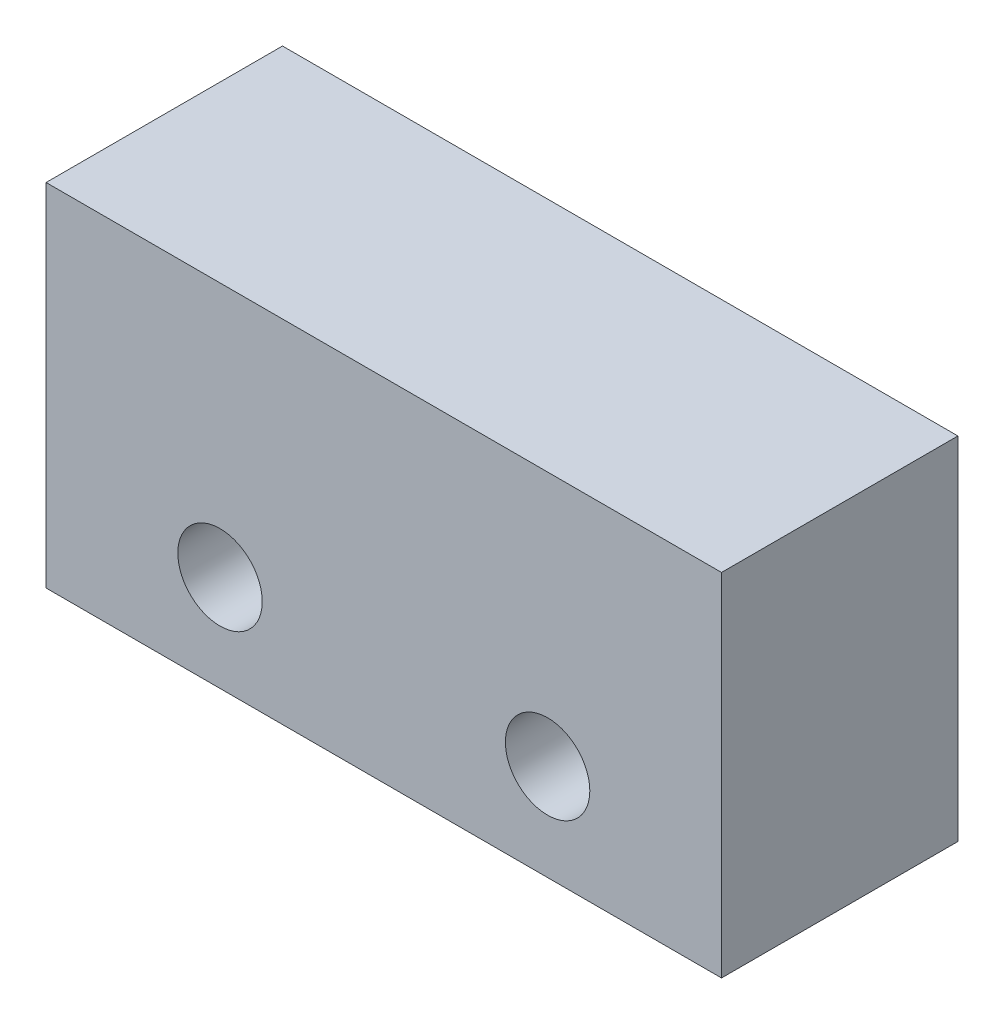
ISO-10303-21;
HEADER;
FILE_DESCRIPTION(('STEP AP214'),'2;1');
FILE_NAME('part.step','',(''),(''),'','','');
FILE_SCHEMA(('AUTOMOTIVE_DESIGN { 1 0 10303 214 1 1 1 1 }'));
ENDSEC;
DATA;
#1=APPLICATION_CONTEXT('core data for automotive mechanical design processes');
#2=APPLICATION_PROTOCOL_DEFINITION('international standard','automotive_design',2000,#1);
#3=PRODUCT_CONTEXT('',#1,'mechanical');
#4=PRODUCT('Part','Part','',(#3));
#5=PRODUCT_RELATED_PRODUCT_CATEGORY('part','',(#4));
#6=PRODUCT_DEFINITION_FORMATION('','',#4);
#7=PRODUCT_DEFINITION_CONTEXT('part definition',#1,'design');
#8=PRODUCT_DEFINITION('design','',#6,#7);
#9=PRODUCT_DEFINITION_SHAPE('','',#8);
#10=(LENGTH_UNIT() NAMED_UNIT(*) SI_UNIT(.MILLI.,.METRE.));
#11=(NAMED_UNIT(*) PLANE_ANGLE_UNIT() SI_UNIT($,.RADIAN.));
#12=(NAMED_UNIT(*) SI_UNIT($,.STERADIAN.) SOLID_ANGLE_UNIT());
#13=UNCERTAINTY_MEASURE_WITH_UNIT(LENGTH_MEASURE(1.E-05),#10,'distance_accuracy_value','');
#14=(GEOMETRIC_REPRESENTATION_CONTEXT(3) GLOBAL_UNCERTAINTY_ASSIGNED_CONTEXT((#13)) GLOBAL_UNIT_ASSIGNED_CONTEXT((#10,
#11,#12)) REPRESENTATION_CONTEXT('',''));
#15=CARTESIAN_POINT('',(0.,0.,0.));
#16=DIRECTION('',(0.,0.,1.));
#17=DIRECTION('',(1.,0.,0.));
#18=AXIS2_PLACEMENT_3D('',#15,#16,#17);
#19=CARTESIAN_POINT('',(0.,0.,7.));
#20=DIRECTION('',(0.,0.,1.));
#21=DIRECTION('',(1.,0.,0.));
#22=AXIS2_PLACEMENT_3D('',#19,#20,#21);
#23=PLANE('',#22);
#24=CARTESIAN_POINT('',(5.14999999999954,2.85000000000025,7.));
#25=DIRECTION('',(0.,0.,1.));
#26=DIRECTION('',(1.,0.,0.));
#27=AXIS2_PLACEMENT_3D('',#24,#25,#26);
#28=CIRCLE('',#27,1.2500000000002);
#29=CARTESIAN_POINT('',(6.39999999999974,2.85000000000025,7.));
#30=VERTEX_POINT('',#29);
#31=EDGE_CURVE('E102',#30,#30,#28,.T.);
#32=ORIENTED_EDGE('',*,*,#31,.F.);
#33=EDGE_LOOP('',(#32));
#34=FACE_BOUND('',#33,.T.);
#35=DIRECTION('',(-1.,0.,0.));
#36=VECTOR('',#35,1.);
#37=CARTESIAN_POINT('',(20.,10.4,7.));
#38=LINE('',#37,#36);
#39=CARTESIAN_POINT('',(20.,10.4,7.));
#40=VERTEX_POINT('',#39);
#41=CARTESIAN_POINT('',(0.,10.4,7.));
#42=VERTEX_POINT('',#41);
#43=EDGE_CURVE('E87',#40,#42,#38,.T.);
#44=ORIENTED_EDGE('',*,*,#43,.T.);
#45=DIRECTION('',(0.,-1.,0.));
#46=VECTOR('',#45,1.);
#47=CARTESIAN_POINT('',(0.,10.4,7.));
#48=LINE('',#47,#46);
#49=CARTESIAN_POINT('',(0.,0.,7.));
#50=VERTEX_POINT('',#49);
#51=EDGE_CURVE('E82',#42,#50,#48,.T.);
#52=ORIENTED_EDGE('',*,*,#51,.T.);
#53=DIRECTION('',(1.,0.,0.));
#54=VECTOR('',#53,1.);
#55=CARTESIAN_POINT('',(0.,0.,7.));
#56=LINE('',#55,#54);
#57=CARTESIAN_POINT('',(20.,0.,7.));
#58=VERTEX_POINT('',#57);
#59=EDGE_CURVE('E85',#50,#58,#56,.T.);
#60=ORIENTED_EDGE('',*,*,#59,.T.);
#61=DIRECTION('',(0.,1.,0.));
#62=VECTOR('',#61,1.);
#63=CARTESIAN_POINT('',(20.,0.,7.));
#64=LINE('',#63,#62);
#65=EDGE_CURVE('E52',#58,#40,#64,.T.);
#66=ORIENTED_EDGE('',*,*,#65,.T.);
#67=EDGE_LOOP('',(#44,#52,#60,#66));
#68=FACE_BOUND('',#67,.T.);
#69=CARTESIAN_POINT('',(14.8500000000005,2.85000000000025,7.));
#70=DIRECTION('',(0.,0.,1.));
#71=DIRECTION('',(1.,0.,0.));
#72=AXIS2_PLACEMENT_3D('',#69,#70,#71);
#73=CIRCLE('',#72,1.2500000000002);
#74=CARTESIAN_POINT('',(16.1000000000007,2.85000000000025,7.));
#75=VERTEX_POINT('',#74);
#76=EDGE_CURVE('E117',#75,#75,#73,.T.);
#77=ORIENTED_EDGE('',*,*,#76,.F.);
#78=EDGE_LOOP('',(#77));
#79=FACE_BOUND('',#78,.T.);
#80=ADVANCED_FACE('F35',(#34,#68,#79),#23,.T.);
#81=CARTESIAN_POINT('',(0.,0.,0.));
#82=DIRECTION('',(0.,0.,1.));
#83=DIRECTION('',(1.,0.,0.));
#84=AXIS2_PLACEMENT_3D('',#81,#82,#83);
#85=PLANE('',#84);
#86=CARTESIAN_POINT('',(5.14999999999954,2.85000000000025,0.));
#87=DIRECTION('',(0.,0.,1.));
#88=DIRECTION('',(1.,0.,0.));
#89=AXIS2_PLACEMENT_3D('',#86,#87,#88);
#90=CIRCLE('',#89,1.2500000000002);
#91=CARTESIAN_POINT('',(6.39999999999974,2.85000000000025,0.));
#92=VERTEX_POINT('',#91);
#93=EDGE_CURVE('E114',#92,#92,#90,.T.);
#94=ORIENTED_EDGE('',*,*,#93,.T.);
#95=EDGE_LOOP('',(#94));
#96=FACE_BOUND('',#95,.T.);
#97=DIRECTION('',(-1.,0.,0.));
#98=VECTOR('',#97,1.);
#99=CARTESIAN_POINT('',(20.,10.4,0.));
#100=LINE('',#99,#98);
#101=CARTESIAN_POINT('',(20.,10.4,0.));
#102=VERTEX_POINT('',#101);
#103=CARTESIAN_POINT('',(0.,10.4,0.));
#104=VERTEX_POINT('',#103);
#105=EDGE_CURVE('E99',#102,#104,#100,.T.);
#106=ORIENTED_EDGE('',*,*,#105,.F.);
#107=DIRECTION('',(0.,1.,0.));
#108=VECTOR('',#107,1.);
#109=CARTESIAN_POINT('',(20.,0.,0.));
#110=LINE('',#109,#108);
#111=CARTESIAN_POINT('',(20.,0.,0.));
#112=VERTEX_POINT('',#111);
#113=EDGE_CURVE('E75',#112,#102,#110,.T.);
#114=ORIENTED_EDGE('',*,*,#113,.F.);
#115=DIRECTION('',(1.,0.,0.));
#116=VECTOR('',#115,1.);
#117=CARTESIAN_POINT('',(0.,0.,0.));
#118=LINE('',#117,#116);
#119=CARTESIAN_POINT('',(0.,0.,0.));
#120=VERTEX_POINT('',#119);
#121=EDGE_CURVE('E69',#120,#112,#118,.T.);
#122=ORIENTED_EDGE('',*,*,#121,.F.);
#123=DIRECTION('',(0.,-1.,0.));
#124=VECTOR('',#123,1.);
#125=CARTESIAN_POINT('',(0.,10.4,0.));
#126=LINE('',#125,#124);
#127=EDGE_CURVE('E91',#104,#120,#126,.T.);
#128=ORIENTED_EDGE('',*,*,#127,.F.);
#129=EDGE_LOOP('',(#106,#114,#122,#128));
#130=FACE_BOUND('',#129,.T.);
#131=CARTESIAN_POINT('',(14.8500000000005,2.85000000000025,0.));
#132=DIRECTION('',(0.,0.,1.));
#133=DIRECTION('',(1.,0.,0.));
#134=AXIS2_PLACEMENT_3D('',#131,#132,#133);
#135=CIRCLE('',#134,1.2500000000002);
#136=CARTESIAN_POINT('',(16.1000000000007,2.85000000000025,0.));
#137=VERTEX_POINT('',#136);
#138=EDGE_CURVE('E120',#137,#137,#135,.T.);
#139=ORIENTED_EDGE('',*,*,#138,.T.);
#140=EDGE_LOOP('',(#139));
#141=FACE_BOUND('',#140,.T.);
#142=ADVANCED_FACE('F110',(#96,#130,#141),#85,.F.);
#143=CARTESIAN_POINT('',(20.,10.4,7.));
#144=DIRECTION('',(0.,-1.,0.));
#145=DIRECTION('',(0.,0.,-1.));
#146=AXIS2_PLACEMENT_3D('',#143,#144,#145);
#147=PLANE('',#146);
#148=ORIENTED_EDGE('',*,*,#105,.T.);
#149=DIRECTION('',(0.,0.,-1.));
#150=VECTOR('',#149,1.);
#151=CARTESIAN_POINT('',(0.,10.4,7.));
#152=LINE('',#151,#150);
#153=EDGE_CURVE('E11',#42,#104,#152,.T.);
#154=ORIENTED_EDGE('',*,*,#153,.F.);
#155=ORIENTED_EDGE('',*,*,#43,.F.);
#156=DIRECTION('',(0.,0.,-1.));
#157=VECTOR('',#156,1.);
#158=CARTESIAN_POINT('',(20.,10.4,7.));
#159=LINE('',#158,#157);
#160=EDGE_CURVE('E95',#40,#102,#159,.T.);
#161=ORIENTED_EDGE('',*,*,#160,.T.);
#162=EDGE_LOOP('',(#148,#154,#155,#161));
#163=FACE_BOUND('',#162,.T.);
#164=ADVANCED_FACE('F37',(#163),#147,.F.);
#165=CARTESIAN_POINT('',(0.,10.4,7.));
#166=DIRECTION('',(1.,0.,0.));
#167=DIRECTION('',(0.,0.,-1.));
#168=AXIS2_PLACEMENT_3D('',#165,#166,#167);
#169=PLANE('',#168);
#170=ORIENTED_EDGE('',*,*,#127,.T.);
#171=DIRECTION('',(0.,0.,-1.));
#172=VECTOR('',#171,1.);
#173=CARTESIAN_POINT('',(0.,0.,7.));
#174=LINE('',#173,#172);
#175=EDGE_CURVE('E44',#50,#120,#174,.T.);
#176=ORIENTED_EDGE('',*,*,#175,.F.);
#177=ORIENTED_EDGE('',*,*,#51,.F.);
#178=ORIENTED_EDGE('',*,*,#153,.T.);
#179=EDGE_LOOP('',(#170,#176,#177,#178));
#180=FACE_BOUND('',#179,.T.);
#181=ADVANCED_FACE('F90',(#180),#169,.F.);
#182=CARTESIAN_POINT('',(0.,0.,7.));
#183=DIRECTION('',(0.,1.,0.));
#184=DIRECTION('',(0.,0.,1.));
#185=AXIS2_PLACEMENT_3D('',#182,#183,#184);
#186=PLANE('',#185);
#187=ORIENTED_EDGE('',*,*,#121,.T.);
#188=DIRECTION('',(0.,0.,-1.));
#189=VECTOR('',#188,1.);
#190=CARTESIAN_POINT('',(20.,0.,7.));
#191=LINE('',#190,#189);
#192=EDGE_CURVE('E92',#58,#112,#191,.T.);
#193=ORIENTED_EDGE('',*,*,#192,.F.);
#194=ORIENTED_EDGE('',*,*,#59,.F.);
#195=ORIENTED_EDGE('',*,*,#175,.T.);
#196=EDGE_LOOP('',(#187,#193,#194,#195));
#197=FACE_BOUND('',#196,.T.);
#198=ADVANCED_FACE('F93',(#197),#186,.F.);
#199=CARTESIAN_POINT('',(20.,0.,7.));
#200=DIRECTION('',(-1.,0.,0.));
#201=DIRECTION('',(0.,0.,1.));
#202=AXIS2_PLACEMENT_3D('',#199,#200,#201);
#203=PLANE('',#202);
#204=ORIENTED_EDGE('',*,*,#113,.T.);
#205=ORIENTED_EDGE('',*,*,#160,.F.);
#206=ORIENTED_EDGE('',*,*,#65,.F.);
#207=ORIENTED_EDGE('',*,*,#192,.T.);
#208=EDGE_LOOP('',(#204,#205,#206,#207));
#209=FACE_BOUND('',#208,.T.);
#210=ADVANCED_FACE('F107',(#209),#203,.F.);
#211=CARTESIAN_POINT('',(5.14999999999954,2.85000000000025,7.));
#212=DIRECTION('',(0.,0.,-1.));
#213=DIRECTION('',(-1.,0.,0.));
#214=AXIS2_PLACEMENT_3D('',#211,#212,#213);
#215=CYLINDRICAL_SURFACE('',#214,1.2500000000002);
#216=ORIENTED_EDGE('',*,*,#31,.T.);
#217=EDGE_LOOP('',(#216));
#218=FACE_BOUND('',#217,.T.);
#219=ORIENTED_EDGE('',*,*,#93,.F.);
#220=EDGE_LOOP('',(#219));
#221=FACE_BOUND('',#220,.T.);
#222=ADVANCED_FACE('F138',(#218,#221),#215,.F.);
#223=CARTESIAN_POINT('',(14.8500000000005,2.85000000000025,7.));
#224=DIRECTION('',(0.,0.,-1.));
#225=DIRECTION('',(-1.,0.,0.));
#226=AXIS2_PLACEMENT_3D('',#223,#224,#225);
#227=CYLINDRICAL_SURFACE('',#226,1.2500000000002);
#228=ORIENTED_EDGE('',*,*,#76,.T.);
#229=EDGE_LOOP('',(#228));
#230=FACE_BOUND('',#229,.T.);
#231=ORIENTED_EDGE('',*,*,#138,.F.);
#232=EDGE_LOOP('',(#231));
#233=FACE_BOUND('',#232,.T.);
#234=ADVANCED_FACE('F126',(#230,#233),#227,.F.);
#235=CLOSED_SHELL('',(#80,#142,#164,#181,#198,#210,#222,#234));
#236=MANIFOLD_SOLID_BREP('B2',#235);
#237=ADVANCED_BREP_SHAPE_REPRESENTATION('',(#18,#236),#14);
#238=SHAPE_DEFINITION_REPRESENTATION(#9,#237);
ENDSEC;
END-ISO-10303-21;
